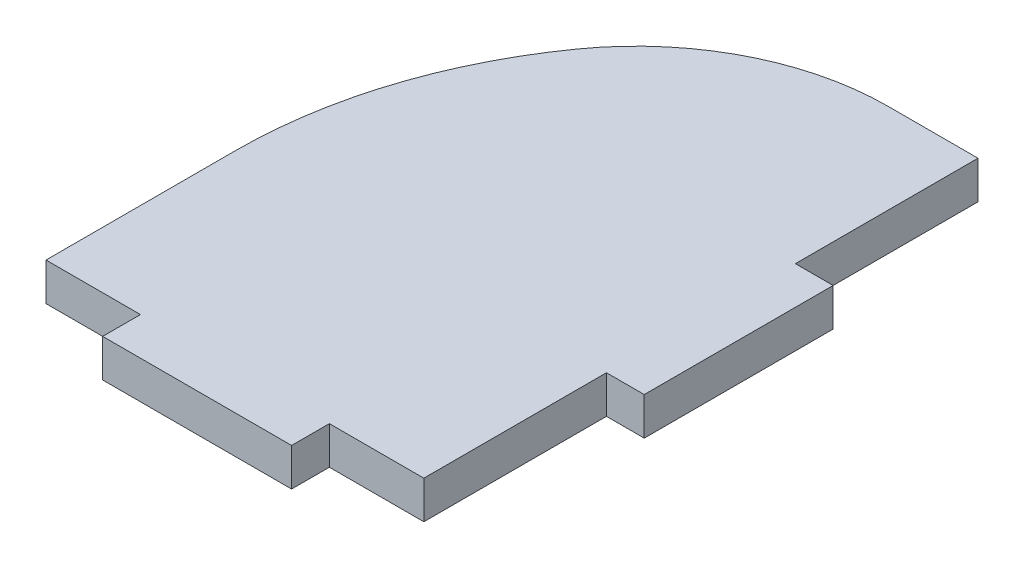
ISO-10303-21;
HEADER;
FILE_DESCRIPTION(('STEP AP214'),'2;1');
FILE_NAME('part.step','',(''),(''),'','','');
FILE_SCHEMA(('AUTOMOTIVE_DESIGN { 1 0 10303 214 1 1 1 1 }'));
ENDSEC;
DATA;
#1=APPLICATION_CONTEXT('core data for automotive mechanical design processes');
#2=APPLICATION_PROTOCOL_DEFINITION('international standard','automotive_design',2000,#1);
#3=PRODUCT_CONTEXT('',#1,'mechanical');
#4=PRODUCT('Part','Part','',(#3));
#5=PRODUCT_RELATED_PRODUCT_CATEGORY('part','',(#4));
#6=PRODUCT_DEFINITION_FORMATION('','',#4);
#7=PRODUCT_DEFINITION_CONTEXT('part definition',#1,'design');
#8=PRODUCT_DEFINITION('design','',#6,#7);
#9=PRODUCT_DEFINITION_SHAPE('','',#8);
#10=(LENGTH_UNIT() NAMED_UNIT(*) SI_UNIT(.MILLI.,.METRE.));
#11=(NAMED_UNIT(*) PLANE_ANGLE_UNIT() SI_UNIT($,.RADIAN.));
#12=(NAMED_UNIT(*) SI_UNIT($,.STERADIAN.) SOLID_ANGLE_UNIT());
#13=UNCERTAINTY_MEASURE_WITH_UNIT(LENGTH_MEASURE(1.E-05),#10,'distance_accuracy_value','');
#14=(GEOMETRIC_REPRESENTATION_CONTEXT(3) GLOBAL_UNCERTAINTY_ASSIGNED_CONTEXT((#13)) GLOBAL_UNIT_ASSIGNED_CONTEXT((#10,
#11,#12)) REPRESENTATION_CONTEXT('',''));
#15=CARTESIAN_POINT('',(0.,0.,0.));
#16=DIRECTION('',(0.,0.,1.));
#17=DIRECTION('',(1.,0.,0.));
#18=AXIS2_PLACEMENT_3D('',#15,#16,#17);
#19=CARTESIAN_POINT('',(15.,3.,-22.));
#20=DIRECTION('',(-1.,0.,0.));
#21=DIRECTION('',(0.,0.,1.));
#22=AXIS2_PLACEMENT_3D('',#19,#20,#21);
#23=PLANE('',#22);
#24=DIRECTION('',(0.,1.,0.));
#25=VECTOR('',#24,1.);
#26=CARTESIAN_POINT('',(15.,0.,-7.5));
#27=LINE('',#26,#25);
#28=CARTESIAN_POINT('',(15.,0.,-7.5));
#29=VERTEX_POINT('',#28);
#30=CARTESIAN_POINT('',(15.,3.,-7.5));
#31=VERTEX_POINT('',#30);
#32=EDGE_CURVE('E239',#29,#31,#27,.T.);
#33=ORIENTED_EDGE('',*,*,#32,.F.);
#34=DIRECTION('',(0.,0.,-1.));
#35=VECTOR('',#34,1.);
#36=CARTESIAN_POINT('',(15.,0.,-22.));
#37=LINE('',#36,#35);
#38=CARTESIAN_POINT('',(15.,0.,-22.));
#39=VERTEX_POINT('',#38);
#40=EDGE_CURVE('E162',#29,#39,#37,.T.);
#41=ORIENTED_EDGE('',*,*,#40,.T.);
#42=DIRECTION('',(0.,-1.,0.));
#43=VECTOR('',#42,1.);
#44=CARTESIAN_POINT('',(15.,3.,-22.));
#45=LINE('',#44,#43);
#46=CARTESIAN_POINT('',(15.,3.,-22.));
#47=VERTEX_POINT('',#46);
#48=EDGE_CURVE('E193',#47,#39,#45,.T.);
#49=ORIENTED_EDGE('',*,*,#48,.F.);
#50=DIRECTION('',(0.,0.,-1.));
#51=VECTOR('',#50,1.);
#52=CARTESIAN_POINT('',(15.,3.,-22.));
#53=LINE('',#52,#51);
#54=EDGE_CURVE('E192',#31,#47,#53,.T.);
#55=ORIENTED_EDGE('',*,*,#54,.F.);
#56=EDGE_LOOP('',(#33,#41,#49,#55));
#57=FACE_BOUND('',#56,.T.);
#58=ADVANCED_FACE('F33',(#57),#23,.F.);
#59=CARTESIAN_POINT('',(-15.,3.,22.));
#60=DIRECTION('',(0.,0.,-1.));
#61=DIRECTION('',(-1.,0.,0.));
#62=AXIS2_PLACEMENT_3D('',#59,#60,#61);
#63=PLANE('',#62);
#64=DIRECTION('',(0.,1.,0.));
#65=VECTOR('',#64,1.);
#66=CARTESIAN_POINT('',(7.5,0.,22.));
#67=LINE('',#66,#65);
#68=CARTESIAN_POINT('',(7.5,0.,22.));
#69=VERTEX_POINT('',#68);
#70=CARTESIAN_POINT('',(7.5,3.,22.));
#71=VERTEX_POINT('',#70);
#72=EDGE_CURVE('E220',#69,#71,#67,.T.);
#73=ORIENTED_EDGE('',*,*,#72,.F.);
#74=DIRECTION('',(1.,0.,0.));
#75=VECTOR('',#74,1.);
#76=CARTESIAN_POINT('',(-15.,0.,22.));
#77=LINE('',#76,#75);
#78=CARTESIAN_POINT('',(15.,0.,22.));
#79=VERTEX_POINT('',#78);
#80=EDGE_CURVE('E181',#69,#79,#77,.T.);
#81=ORIENTED_EDGE('',*,*,#80,.T.);
#82=DIRECTION('',(0.,-1.,0.));
#83=VECTOR('',#82,1.);
#84=CARTESIAN_POINT('',(15.,3.,22.));
#85=LINE('',#84,#83);
#86=CARTESIAN_POINT('',(15.,3.,22.));
#87=VERTEX_POINT('',#86);
#88=EDGE_CURVE('E160',#87,#79,#85,.T.);
#89=ORIENTED_EDGE('',*,*,#88,.F.);
#90=DIRECTION('',(1.,0.,0.));
#91=VECTOR('',#90,1.);
#92=CARTESIAN_POINT('',(-15.,3.,22.));
#93=LINE('',#92,#91);
#94=EDGE_CURVE('E204',#71,#87,#93,.T.);
#95=ORIENTED_EDGE('',*,*,#94,.F.);
#96=EDGE_LOOP('',(#73,#81,#89,#95));
#97=FACE_BOUND('',#96,.T.);
#98=ADVANCED_FACE('F308',(#97),#63,.F.);
#99=CARTESIAN_POINT('',(15.,0.,7.5));
#100=VERTEX_POINT('',#99);
#101=EDGE_CURVE('E151',#79,#100,#37,.T.);
#102=ORIENTED_EDGE('',*,*,#101,.T.);
#103=DIRECTION('',(0.,1.,0.));
#104=VECTOR('',#103,1.);
#105=CARTESIAN_POINT('',(15.,0.,7.5));
#106=LINE('',#105,#104);
#107=CARTESIAN_POINT('',(15.,3.,7.5));
#108=VERTEX_POINT('',#107);
#109=EDGE_CURVE('E133',#100,#108,#106,.T.);
#110=ORIENTED_EDGE('',*,*,#109,.T.);
#111=EDGE_CURVE('E269',#87,#108,#53,.T.);
#112=ORIENTED_EDGE('',*,*,#111,.F.);
#113=ORIENTED_EDGE('',*,*,#88,.T.);
#114=EDGE_LOOP('',(#102,#110,#112,#113));
#115=FACE_BOUND('',#114,.T.);
#116=ADVANCED_FACE('F158',(#115),#23,.F.);
#117=CARTESIAN_POINT('',(-15.,3.,-22.));
#118=DIRECTION('',(0.,0.,1.));
#119=DIRECTION('',(1.,0.,0.));
#120=AXIS2_PLACEMENT_3D('',#117,#118,#119);
#121=PLANE('',#120);
#122=DIRECTION('',(-1.,0.,0.));
#123=VECTOR('',#122,1.);
#124=CARTESIAN_POINT('',(-15.,0.,-22.));
#125=LINE('',#124,#123);
#126=CARTESIAN_POINT('',(7.8729840314995,0.,-22.));
#127=VERTEX_POINT('',#126);
#128=EDGE_CURVE('E161',#39,#127,#125,.T.);
#129=ORIENTED_EDGE('',*,*,#128,.T.);
#130=DIRECTION('',(0.,1.,0.));
#131=VECTOR('',#130,1.);
#132=CARTESIAN_POINT('',(7.8729840314995,3.,-22.));
#133=LINE('',#132,#131);
#134=CARTESIAN_POINT('',(7.8729840314995,3.,-22.));
#135=VERTEX_POINT('',#134);
#136=EDGE_CURVE('E195',#127,#135,#133,.T.);
#137=ORIENTED_EDGE('',*,*,#136,.T.);
#138=DIRECTION('',(-1.,0.,0.));
#139=VECTOR('',#138,1.);
#140=CARTESIAN_POINT('',(-15.,3.,-22.));
#141=LINE('',#140,#139);
#142=EDGE_CURVE('E273',#47,#135,#141,.T.);
#143=ORIENTED_EDGE('',*,*,#142,.F.);
#144=ORIENTED_EDGE('',*,*,#48,.T.);
#145=EDGE_LOOP('',(#129,#137,#143,#144));
#146=FACE_BOUND('',#145,.T.);
#147=ADVANCED_FACE('F317',(#146),#121,.F.);
#148=CARTESIAN_POINT('',(-15.,3.,-22.));
#149=DIRECTION('',(1.,0.,0.));
#150=DIRECTION('',(0.,0.,-1.));
#151=AXIS2_PLACEMENT_3D('',#148,#149,#150);
#152=PLANE('',#151);
#153=DIRECTION('',(0.,0.,1.));
#154=VECTOR('',#153,1.);
#155=CARTESIAN_POINT('',(-15.,3.,-22.));
#156=LINE('',#155,#154);
#157=CARTESIAN_POINT('',(-15.,3.,7.00000000000001));
#158=VERTEX_POINT('',#157);
#159=CARTESIAN_POINT('',(-15.,3.,22.));
#160=VERTEX_POINT('',#159);
#161=EDGE_CURVE('E206',#158,#160,#156,.T.);
#162=ORIENTED_EDGE('',*,*,#161,.F.);
#163=DIRECTION('',(0.,1.,0.));
#164=VECTOR('',#163,1.);
#165=CARTESIAN_POINT('',(-15.,0.,7.00000000000001));
#166=LINE('',#165,#164);
#167=CARTESIAN_POINT('',(-15.,0.,7.00000000000001));
#168=VERTEX_POINT('',#167);
#169=EDGE_CURVE('E167',#168,#158,#166,.T.);
#170=ORIENTED_EDGE('',*,*,#169,.F.);
#171=DIRECTION('',(0.,0.,1.));
#172=VECTOR('',#171,1.);
#173=CARTESIAN_POINT('',(-15.,0.,-22.));
#174=LINE('',#173,#172);
#175=CARTESIAN_POINT('',(-15.,0.,22.));
#176=VERTEX_POINT('',#175);
#177=EDGE_CURVE('E165',#168,#176,#174,.T.);
#178=ORIENTED_EDGE('',*,*,#177,.T.);
#179=DIRECTION('',(0.,-1.,0.));
#180=VECTOR('',#179,1.);
#181=CARTESIAN_POINT('',(-15.,3.,22.));
#182=LINE('',#181,#180);
#183=EDGE_CURVE('E196',#160,#176,#182,.T.);
#184=ORIENTED_EDGE('',*,*,#183,.F.);
#185=EDGE_LOOP('',(#162,#170,#178,#184));
#186=FACE_BOUND('',#185,.T.);
#187=ADVANCED_FACE('F280',(#186),#152,.F.);
#188=CARTESIAN_POINT('',(-7.5,0.,22.));
#189=VERTEX_POINT('',#188);
#190=EDGE_CURVE('E189',#176,#189,#77,.T.);
#191=ORIENTED_EDGE('',*,*,#190,.T.);
#192=DIRECTION('',(0.,1.,0.));
#193=VECTOR('',#192,1.);
#194=CARTESIAN_POINT('',(-7.5,0.,22.));
#195=LINE('',#194,#193);
#196=CARTESIAN_POINT('',(-7.5,3.,22.));
#197=VERTEX_POINT('',#196);
#198=EDGE_CURVE('E215',#189,#197,#195,.T.);
#199=ORIENTED_EDGE('',*,*,#198,.T.);
#200=EDGE_CURVE('E202',#160,#197,#93,.T.);
#201=ORIENTED_EDGE('',*,*,#200,.F.);
#202=ORIENTED_EDGE('',*,*,#183,.T.);
#203=EDGE_LOOP('',(#191,#199,#201,#202));
#204=FACE_BOUND('',#203,.T.);
#205=ADVANCED_FACE('F282',(#204),#63,.F.);
#206=CARTESIAN_POINT('',(0.,3.,0.));
#207=DIRECTION('',(0.,1.,0.));
#208=DIRECTION('',(0.,0.,1.));
#209=AXIS2_PLACEMENT_3D('',#206,#207,#208);
#210=PLANE('',#209);
#211=ORIENTED_EDGE('',*,*,#142,.T.);
#212=CARTESIAN_POINT('',(7.8729840314995,3.,-1.99999999999999));
#213=DIRECTION('',(0.,1.,0.));
#214=DIRECTION('',(0.,0.,1.));
#215=AXIS2_PLACEMENT_3D('',#212,#213,#214);
#216=CIRCLE('',#215,20.);
#217=CARTESIAN_POINT('',(-8.42789489790028,3.,-13.587982832618));
#218=VERTEX_POINT('',#217);
#219=EDGE_CURVE('E55',#135,#218,#216,.T.);
#220=ORIENTED_EDGE('',*,*,#219,.T.);
#221=CARTESIAN_POINT('',(20.5333333333333,3.,7.00000000000001));
#222=DIRECTION('',(0.,-1.,0.));
#223=DIRECTION('',(0.,0.,-1.));
#224=AXIS2_PLACEMENT_3D('',#221,#222,#223);
#225=CIRCLE('',#224,35.5333333333333);
#226=EDGE_CURVE('E277',#158,#218,#225,.T.);
#227=ORIENTED_EDGE('',*,*,#226,.F.);
#228=ORIENTED_EDGE('',*,*,#161,.T.);
#229=ORIENTED_EDGE('',*,*,#200,.T.);
#230=DIRECTION('',(0.,0.,1.));
#231=VECTOR('',#230,1.);
#232=CARTESIAN_POINT('',(-7.5,3.,22.));
#233=LINE('',#232,#231);
#234=CARTESIAN_POINT('',(-7.5,3.,25.));
#235=VERTEX_POINT('',#234);
#236=EDGE_CURVE('E209',#197,#235,#233,.T.);
#237=ORIENTED_EDGE('',*,*,#236,.T.);
#238=DIRECTION('',(1.,0.,0.));
#239=VECTOR('',#238,1.);
#240=CARTESIAN_POINT('',(7.5,3.,25.));
#241=LINE('',#240,#239);
#242=CARTESIAN_POINT('',(7.5,3.,25.));
#243=VERTEX_POINT('',#242);
#244=EDGE_CURVE('E211',#235,#243,#241,.T.);
#245=ORIENTED_EDGE('',*,*,#244,.T.);
#246=DIRECTION('',(0.,0.,-1.));
#247=VECTOR('',#246,1.);
#248=CARTESIAN_POINT('',(7.5,3.,22.));
#249=LINE('',#248,#247);
#250=EDGE_CURVE('E212',#243,#71,#249,.T.);
#251=ORIENTED_EDGE('',*,*,#250,.T.);
#252=ORIENTED_EDGE('',*,*,#94,.T.);
#253=ORIENTED_EDGE('',*,*,#111,.T.);
#254=DIRECTION('',(1.,0.,0.));
#255=VECTOR('',#254,1.);
#256=CARTESIAN_POINT('',(15.,3.,7.5));
#257=LINE('',#256,#255);
#258=CARTESIAN_POINT('',(18.,3.,7.5));
#259=VERTEX_POINT('',#258);
#260=EDGE_CURVE('E138',#108,#259,#257,.T.);
#261=ORIENTED_EDGE('',*,*,#260,.T.);
#262=DIRECTION('',(0.,0.,-1.));
#263=VECTOR('',#262,1.);
#264=CARTESIAN_POINT('',(18.,3.,7.5));
#265=LINE('',#264,#263);
#266=CARTESIAN_POINT('',(18.,3.,-7.5));
#267=VERTEX_POINT('',#266);
#268=EDGE_CURVE('E257',#259,#267,#265,.T.);
#269=ORIENTED_EDGE('',*,*,#268,.T.);
#270=DIRECTION('',(-1.,0.,0.));
#271=VECTOR('',#270,1.);
#272=CARTESIAN_POINT('',(15.,3.,-7.5));
#273=LINE('',#272,#271);
#274=EDGE_CURVE('E155',#267,#31,#273,.T.);
#275=ORIENTED_EDGE('',*,*,#274,.T.);
#276=ORIENTED_EDGE('',*,*,#54,.T.);
#277=EDGE_LOOP('',(#211,#220,#227,#228,#229,#237,#245,#251,#252,#253,#261,#269,#275,#276));
#278=FACE_BOUND('',#277,.T.);
#279=ADVANCED_FACE('F276',(#278),#210,.T.);
#280=CARTESIAN_POINT('',(0.,0.,0.));
#281=DIRECTION('',(0.,1.,0.));
#282=DIRECTION('',(0.,0.,1.));
#283=AXIS2_PLACEMENT_3D('',#280,#281,#282);
#284=PLANE('',#283);
#285=CARTESIAN_POINT('',(20.5333333333333,0.,7.00000000000001));
#286=DIRECTION('',(0.,-1.,0.));
#287=DIRECTION('',(0.,0.,-1.));
#288=AXIS2_PLACEMENT_3D('',#285,#286,#287);
#289=CIRCLE('',#288,35.5333333333333);
#290=CARTESIAN_POINT('',(-8.42789489790028,0.,-13.587982832618));
#291=VERTEX_POINT('',#290);
#292=EDGE_CURVE('E229',#168,#291,#289,.T.);
#293=ORIENTED_EDGE('',*,*,#292,.T.);
#294=CARTESIAN_POINT('',(7.8729840314995,0.,-1.99999999999999));
#295=DIRECTION('',(0.,1.,0.));
#296=DIRECTION('',(0.,0.,1.));
#297=AXIS2_PLACEMENT_3D('',#294,#295,#296);
#298=CIRCLE('',#297,20.);
#299=EDGE_CURVE('E11',#291,#127,#298,.F.);
#300=ORIENTED_EDGE('',*,*,#299,.T.);
#301=ORIENTED_EDGE('',*,*,#128,.F.);
#302=ORIENTED_EDGE('',*,*,#40,.F.);
#303=DIRECTION('',(-1.,0.,0.));
#304=VECTOR('',#303,1.);
#305=CARTESIAN_POINT('',(15.,0.,-7.5));
#306=LINE('',#305,#304);
#307=CARTESIAN_POINT('',(18.,0.,-7.5));
#308=VERTEX_POINT('',#307);
#309=EDGE_CURVE('E144',#308,#29,#306,.T.);
#310=ORIENTED_EDGE('',*,*,#309,.F.);
#311=DIRECTION('',(0.,0.,-1.));
#312=VECTOR('',#311,1.);
#313=CARTESIAN_POINT('',(18.,0.,7.5));
#314=LINE('',#313,#312);
#315=CARTESIAN_POINT('',(18.,0.,7.5));
#316=VERTEX_POINT('',#315);
#317=EDGE_CURVE('E154',#316,#308,#314,.T.);
#318=ORIENTED_EDGE('',*,*,#317,.F.);
#319=DIRECTION('',(1.,0.,0.));
#320=VECTOR('',#319,1.);
#321=CARTESIAN_POINT('',(15.,0.,7.5));
#322=LINE('',#321,#320);
#323=EDGE_CURVE('E136',#100,#316,#322,.T.);
#324=ORIENTED_EDGE('',*,*,#323,.F.);
#325=ORIENTED_EDGE('',*,*,#101,.F.);
#326=ORIENTED_EDGE('',*,*,#80,.F.);
#327=DIRECTION('',(0.,0.,-1.));
#328=VECTOR('',#327,1.);
#329=CARTESIAN_POINT('',(7.5,0.,22.));
#330=LINE('',#329,#328);
#331=CARTESIAN_POINT('',(7.5,0.,25.));
#332=VERTEX_POINT('',#331);
#333=EDGE_CURVE('E235',#332,#69,#330,.T.);
#334=ORIENTED_EDGE('',*,*,#333,.F.);
#335=DIRECTION('',(1.,0.,0.));
#336=VECTOR('',#335,1.);
#337=CARTESIAN_POINT('',(7.5,0.,25.));
#338=LINE('',#337,#336);
#339=CARTESIAN_POINT('',(-7.5,0.,25.));
#340=VERTEX_POINT('',#339);
#341=EDGE_CURVE('E233',#340,#332,#338,.T.);
#342=ORIENTED_EDGE('',*,*,#341,.F.);
#343=DIRECTION('',(0.,0.,1.));
#344=VECTOR('',#343,1.);
#345=CARTESIAN_POINT('',(-7.5,0.,22.));
#346=LINE('',#345,#344);
#347=EDGE_CURVE('E221',#189,#340,#346,.T.);
#348=ORIENTED_EDGE('',*,*,#347,.F.);
#349=ORIENTED_EDGE('',*,*,#190,.F.);
#350=ORIENTED_EDGE('',*,*,#177,.F.);
#351=EDGE_LOOP('',(#293,#300,#301,#302,#310,#318,#324,#325,#326,#334,#342,#348,#349,#350));
#352=FACE_BOUND('',#351,.T.);
#353=ADVANCED_FACE('F149',(#352),#284,.F.);
#354=CARTESIAN_POINT('',(20.5333333333333,0.,7.00000000000001));
#355=DIRECTION('',(0.,1.,0.));
#356=DIRECTION('',(0.,0.,1.));
#357=AXIS2_PLACEMENT_3D('',#354,#355,#356);
#358=CYLINDRICAL_SURFACE('',#357,35.5333333333333);
#359=ORIENTED_EDGE('',*,*,#226,.T.);
#360=DIRECTION('',(0.,1.,0.));
#361=VECTOR('',#360,1.);
#362=CARTESIAN_POINT('',(-8.42789489790028,0.,-13.587982832618));
#363=LINE('',#362,#361);
#364=EDGE_CURVE('E41',#218,#291,#363,.F.);
#365=ORIENTED_EDGE('',*,*,#364,.T.);
#366=ORIENTED_EDGE('',*,*,#292,.F.);
#367=ORIENTED_EDGE('',*,*,#169,.T.);
#368=EDGE_LOOP('',(#359,#365,#366,#367));
#369=FACE_BOUND('',#368,.T.);
#370=ADVANCED_FACE('F295',(#369),#358,.T.);
#371=CARTESIAN_POINT('',(7.5,0.,22.));
#372=DIRECTION('',(1.,0.,0.));
#373=DIRECTION('',(0.,0.,-1.));
#374=AXIS2_PLACEMENT_3D('',#371,#372,#373);
#375=PLANE('',#374);
#376=ORIENTED_EDGE('',*,*,#250,.F.);
#377=DIRECTION('',(0.,1.,0.));
#378=VECTOR('',#377,1.);
#379=CARTESIAN_POINT('',(7.5,0.,25.));
#380=LINE('',#379,#378);
#381=EDGE_CURVE('E293',#332,#243,#380,.T.);
#382=ORIENTED_EDGE('',*,*,#381,.F.);
#383=ORIENTED_EDGE('',*,*,#333,.T.);
#384=ORIENTED_EDGE('',*,*,#72,.T.);
#385=EDGE_LOOP('',(#376,#382,#383,#384));
#386=FACE_BOUND('',#385,.T.);
#387=ADVANCED_FACE('F297',(#386),#375,.T.);
#388=CARTESIAN_POINT('',(7.5,0.,25.));
#389=DIRECTION('',(0.,0.,1.));
#390=DIRECTION('',(1.,0.,0.));
#391=AXIS2_PLACEMENT_3D('',#388,#389,#390);
#392=PLANE('',#391);
#393=ORIENTED_EDGE('',*,*,#244,.F.);
#394=DIRECTION('',(0.,1.,0.));
#395=VECTOR('',#394,1.);
#396=CARTESIAN_POINT('',(-7.5,0.,25.));
#397=LINE('',#396,#395);
#398=EDGE_CURVE('E219',#340,#235,#397,.T.);
#399=ORIENTED_EDGE('',*,*,#398,.F.);
#400=ORIENTED_EDGE('',*,*,#341,.T.);
#401=ORIENTED_EDGE('',*,*,#381,.T.);
#402=EDGE_LOOP('',(#393,#399,#400,#401));
#403=FACE_BOUND('',#402,.T.);
#404=ADVANCED_FACE('F292',(#403),#392,.T.);
#405=CARTESIAN_POINT('',(-7.5,0.,22.));
#406=DIRECTION('',(-1.,0.,0.));
#407=DIRECTION('',(0.,0.,1.));
#408=AXIS2_PLACEMENT_3D('',#405,#406,#407);
#409=PLANE('',#408);
#410=ORIENTED_EDGE('',*,*,#236,.F.);
#411=ORIENTED_EDGE('',*,*,#198,.F.);
#412=ORIENTED_EDGE('',*,*,#347,.T.);
#413=ORIENTED_EDGE('',*,*,#398,.T.);
#414=EDGE_LOOP('',(#410,#411,#412,#413));
#415=FACE_BOUND('',#414,.T.);
#416=ADVANCED_FACE('F286',(#415),#409,.T.);
#417=CARTESIAN_POINT('',(15.,0.,-7.5));
#418=DIRECTION('',(0.,0.,-1.));
#419=DIRECTION('',(-1.,0.,0.));
#420=AXIS2_PLACEMENT_3D('',#417,#418,#419);
#421=PLANE('',#420);
#422=ORIENTED_EDGE('',*,*,#274,.F.);
#423=DIRECTION('',(0.,1.,0.));
#424=VECTOR('',#423,1.);
#425=CARTESIAN_POINT('',(18.,0.,-7.5));
#426=LINE('',#425,#424);
#427=EDGE_CURVE('E243',#308,#267,#426,.T.);
#428=ORIENTED_EDGE('',*,*,#427,.F.);
#429=ORIENTED_EDGE('',*,*,#309,.T.);
#430=ORIENTED_EDGE('',*,*,#32,.T.);
#431=EDGE_LOOP('',(#422,#428,#429,#430));
#432=FACE_BOUND('',#431,.T.);
#433=ADVANCED_FACE('F367',(#432),#421,.T.);
#434=CARTESIAN_POINT('',(18.,0.,7.5));
#435=DIRECTION('',(1.,0.,0.));
#436=DIRECTION('',(0.,0.,-1.));
#437=AXIS2_PLACEMENT_3D('',#434,#435,#436);
#438=PLANE('',#437);
#439=ORIENTED_EDGE('',*,*,#268,.F.);
#440=DIRECTION('',(0.,1.,0.));
#441=VECTOR('',#440,1.);
#442=CARTESIAN_POINT('',(18.,0.,7.5));
#443=LINE('',#442,#441);
#444=EDGE_CURVE('E143',#316,#259,#443,.T.);
#445=ORIENTED_EDGE('',*,*,#444,.F.);
#446=ORIENTED_EDGE('',*,*,#317,.T.);
#447=ORIENTED_EDGE('',*,*,#427,.T.);
#448=EDGE_LOOP('',(#439,#445,#446,#447));
#449=FACE_BOUND('',#448,.T.);
#450=ADVANCED_FACE('F361',(#449),#438,.T.);
#451=CARTESIAN_POINT('',(15.,0.,7.5));
#452=DIRECTION('',(0.,0.,1.));
#453=DIRECTION('',(1.,0.,0.));
#454=AXIS2_PLACEMENT_3D('',#451,#452,#453);
#455=PLANE('',#454);
#456=ORIENTED_EDGE('',*,*,#260,.F.);
#457=ORIENTED_EDGE('',*,*,#109,.F.);
#458=ORIENTED_EDGE('',*,*,#323,.T.);
#459=ORIENTED_EDGE('',*,*,#444,.T.);
#460=EDGE_LOOP('',(#456,#457,#458,#459));
#461=FACE_BOUND('',#460,.T.);
#462=ADVANCED_FACE('F135',(#461),#455,.T.);
#463=CARTESIAN_POINT('',(7.8729840314995,0.,-1.99999999999999));
#464=DIRECTION('',(0.,1.,0.));
#465=DIRECTION('',(0.,0.,1.));
#466=AXIS2_PLACEMENT_3D('',#463,#464,#465);
#467=CYLINDRICAL_SURFACE('',#466,20.);
#468=ORIENTED_EDGE('',*,*,#299,.F.);
#469=ORIENTED_EDGE('',*,*,#364,.F.);
#470=ORIENTED_EDGE('',*,*,#219,.F.);
#471=ORIENTED_EDGE('',*,*,#136,.F.);
#472=EDGE_LOOP('',(#468,#469,#470,#471));
#473=FACE_BOUND('',#472,.T.);
#474=ADVANCED_FACE('F35',(#473),#467,.T.);
#475=CLOSED_SHELL('',(#58,#98,#116,#147,#187,#205,#279,#353,#370,#387,#404,#416,#433,#450,#462,#474));
#476=MANIFOLD_SOLID_BREP('B2',#475);
#477=ADVANCED_BREP_SHAPE_REPRESENTATION('',(#18,#476),#14);
#478=SHAPE_DEFINITION_REPRESENTATION(#9,#477);
ENDSEC;
END-ISO-10303-21;
